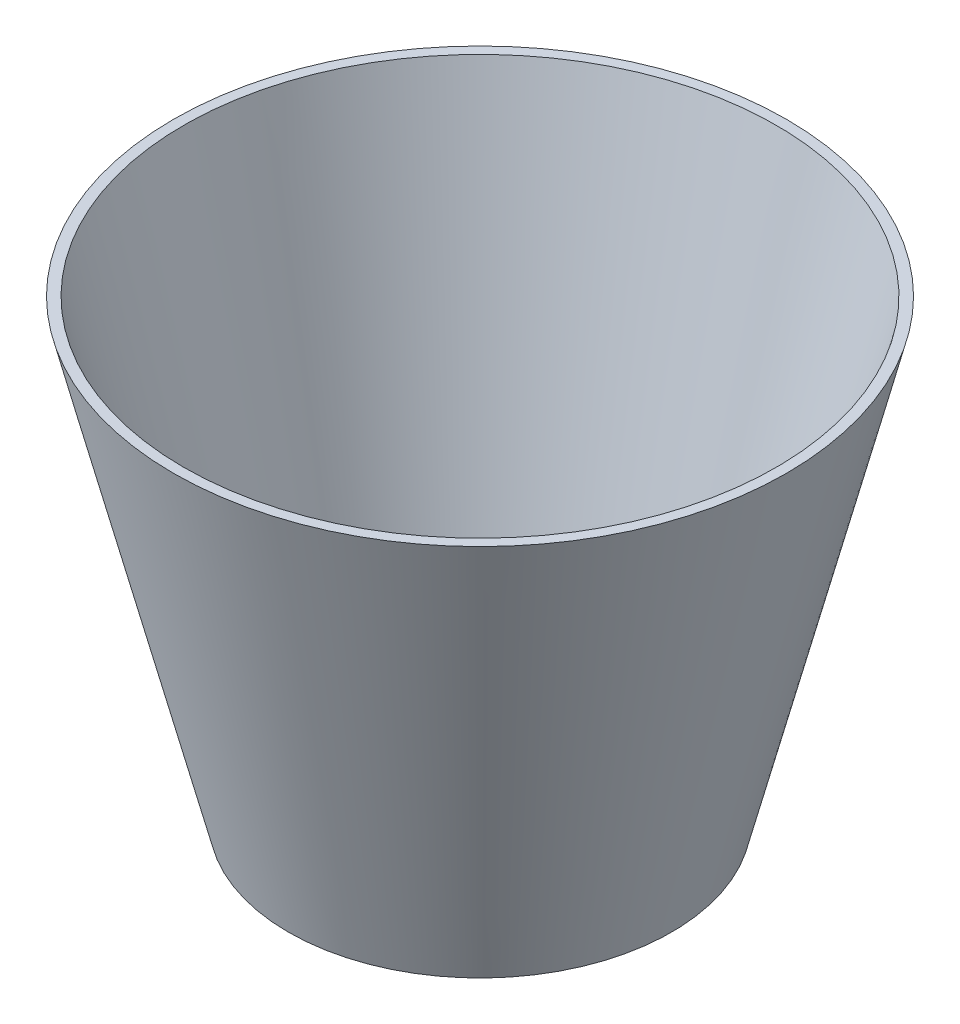
ISO-10303-21;
HEADER;
FILE_DESCRIPTION(('STEP AP214'),'2;1');
FILE_NAME('part.step','',(''),(''),'','','');
FILE_SCHEMA(('AUTOMOTIVE_DESIGN { 1 0 10303 214 1 1 1 1 }'));
ENDSEC;
DATA;
#1=APPLICATION_CONTEXT('core data for automotive mechanical design processes');
#2=APPLICATION_PROTOCOL_DEFINITION('international standard','automotive_design',2000,#1);
#3=PRODUCT_CONTEXT('',#1,'mechanical');
#4=PRODUCT('Part','Part','',(#3));
#5=PRODUCT_RELATED_PRODUCT_CATEGORY('part','',(#4));
#6=PRODUCT_DEFINITION_FORMATION('','',#4);
#7=PRODUCT_DEFINITION_CONTEXT('part definition',#1,'design');
#8=PRODUCT_DEFINITION('design','',#6,#7);
#9=PRODUCT_DEFINITION_SHAPE('','',#8);
#10=(LENGTH_UNIT() NAMED_UNIT(*) SI_UNIT(.MILLI.,.METRE.));
#11=(NAMED_UNIT(*) PLANE_ANGLE_UNIT() SI_UNIT($,.RADIAN.));
#12=(NAMED_UNIT(*) SI_UNIT($,.STERADIAN.) SOLID_ANGLE_UNIT());
#13=UNCERTAINTY_MEASURE_WITH_UNIT(LENGTH_MEASURE(1.E-05),#10,'distance_accuracy_value','');
#14=(GEOMETRIC_REPRESENTATION_CONTEXT(3) GLOBAL_UNCERTAINTY_ASSIGNED_CONTEXT((#13)) GLOBAL_UNIT_ASSIGNED_CONTEXT((#10,
#11,#12)) REPRESENTATION_CONTEXT('',''));
#15=CARTESIAN_POINT('',(0.,0.,0.));
#16=DIRECTION('',(0.,0.,1.));
#17=DIRECTION('',(1.,0.,0.));
#18=AXIS2_PLACEMENT_3D('',#15,#16,#17);
#19=CARTESIAN_POINT('',(0.,0.,0.));
#20=DIRECTION('',(0.,1.,0.));
#21=DIRECTION('',(0.,0.,1.));
#22=AXIS2_PLACEMENT_3D('',#19,#20,#21);
#23=PLANE('',#22);
#24=CARTESIAN_POINT('',(0.,0.,0.));
#25=DIRECTION('',(0.,1.,0.));
#26=DIRECTION('',(0.,0.,1.));
#27=AXIS2_PLACEMENT_3D('',#24,#25,#26);
#28=CIRCLE('',#27,30.0471033641313);
#29=CARTESIAN_POINT('',(0.,0.,30.0471033641313));
#30=VERTEX_POINT('',#29);
#31=EDGE_CURVE('E99',#30,#30,#28,.T.);
#32=ORIENTED_EDGE('',*,*,#31,.T.);
#33=EDGE_LOOP('',(#32));
#34=FACE_BOUND('',#33,.T.);
#35=CARTESIAN_POINT('',(0.,0.,0.));
#36=DIRECTION('',(0.,1.,0.));
#37=DIRECTION('',(0.,0.,1.));
#38=AXIS2_PLACEMENT_3D('',#35,#36,#37);
#39=CIRCLE('',#38,31.75);
#40=CARTESIAN_POINT('',(0.,0.,31.75));
#41=VERTEX_POINT('',#40);
#42=EDGE_CURVE('E38',#41,#41,#39,.T.);
#43=ORIENTED_EDGE('',*,*,#42,.F.);
#44=EDGE_LOOP('',(#43));
#45=FACE_BOUND('',#44,.T.);
#46=ADVANCED_FACE('F30',(#34,#45),#23,.F.);
#47=CARTESIAN_POINT('',(0.,75.3872,0.));
#48=DIRECTION('',(0.,1.,0.));
#49=DIRECTION('',(0.,0.,1.));
#50=AXIS2_PLACEMENT_3D('',#47,#48,#49);
#51=PLANE('',#50);
#52=CARTESIAN_POINT('',(0.,75.3872,0.));
#53=DIRECTION('',(0.,1.,0.));
#54=DIRECTION('',(0.,0.,1.));
#55=AXIS2_PLACEMENT_3D('',#52,#53,#54);
#56=CIRCLE('',#55,49.0971033641313);
#57=CARTESIAN_POINT('',(0.,75.3872,49.0971033641313));
#58=VERTEX_POINT('',#57);
#59=EDGE_CURVE('E44',#58,#58,#56,.T.);
#60=ORIENTED_EDGE('',*,*,#59,.F.);
#61=EDGE_LOOP('',(#60));
#62=FACE_BOUND('',#61,.T.);
#63=CARTESIAN_POINT('',(0.,75.3872,0.));
#64=DIRECTION('',(0.,1.,0.));
#65=DIRECTION('',(0.,0.,1.));
#66=AXIS2_PLACEMENT_3D('',#63,#64,#65);
#67=CIRCLE('',#66,50.8);
#68=CARTESIAN_POINT('',(0.,75.3872,50.8));
#69=VERTEX_POINT('',#68);
#70=EDGE_CURVE('E11',#69,#69,#67,.T.);
#71=ORIENTED_EDGE('',*,*,#70,.T.);
#72=EDGE_LOOP('',(#71));
#73=FACE_BOUND('',#72,.T.);
#74=ADVANCED_FACE('F80',(#62,#73),#51,.T.);
#75=CARTESIAN_POINT('',(0.,0.,0.));
#76=DIRECTION('',(0.,1.,0.));
#77=DIRECTION('',(0.,0.,1.));
#78=AXIS2_PLACEMENT_3D('',#75,#76,#77);
#79=CONICAL_SURFACE('',#78,31.75,0.247513913597473);
#80=ORIENTED_EDGE('',*,*,#70,.F.);
#81=EDGE_LOOP('',(#80));
#82=FACE_BOUND('',#81,.T.);
#83=ORIENTED_EDGE('',*,*,#42,.T.);
#84=EDGE_LOOP('',(#83));
#85=FACE_BOUND('',#84,.T.);
#86=ADVANCED_FACE('F64',(#82,#85),#79,.T.);
#87=CARTESIAN_POINT('',(0.,0.404485749750379,0.));
#88=DIRECTION('',(0.,1.,0.));
#89=DIRECTION('',(0.,0.,1.));
#90=AXIS2_PLACEMENT_3D('',#87,#88,#89);
#91=CONICAL_SURFACE('',#90,30.1493150596545,0.247513913597473);
#92=ORIENTED_EDGE('',*,*,#59,.T.);
#93=EDGE_LOOP('',(#92));
#94=FACE_BOUND('',#93,.T.);
#95=ORIENTED_EDGE('',*,*,#31,.F.);
#96=EDGE_LOOP('',(#95));
#97=FACE_BOUND('',#96,.T.);
#98=ADVANCED_FACE('F79',(#94,#97),#91,.F.);
#99=CLOSED_SHELL('',(#46,#74,#86,#98));
#100=MANIFOLD_SOLID_BREP('B2',#99);
#101=ADVANCED_BREP_SHAPE_REPRESENTATION('',(#18,#100),#14);
#102=SHAPE_DEFINITION_REPRESENTATION(#9,#101);
ENDSEC;
END-ISO-10303-21;
